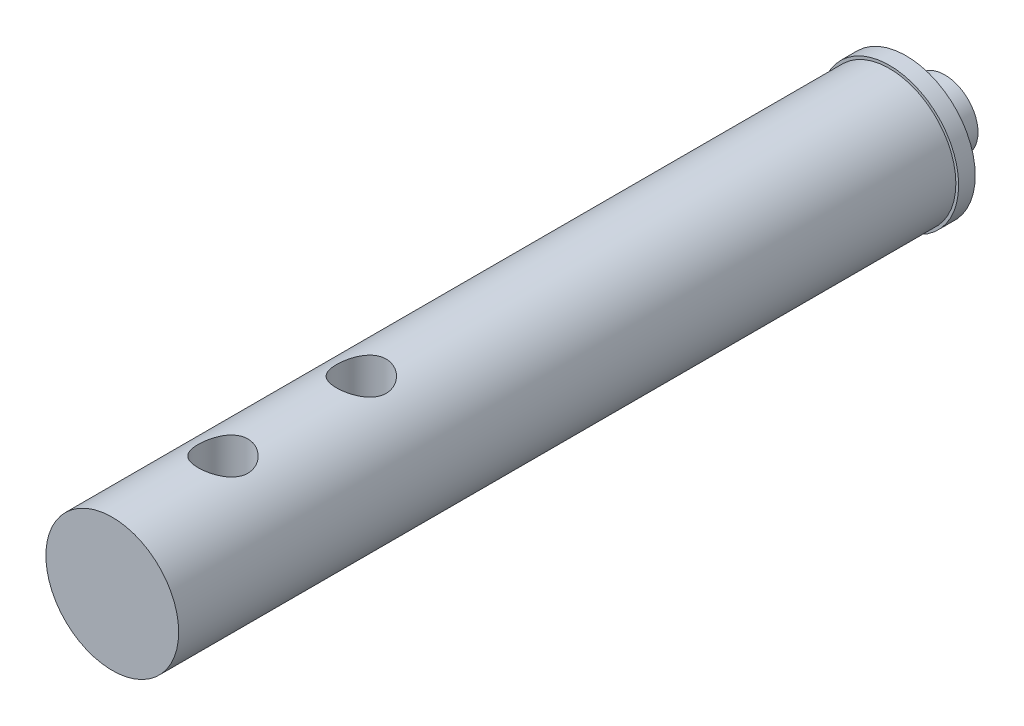
ISO-10303-21;
HEADER;
FILE_DESCRIPTION(('STEP AP214'),'2;1');
FILE_NAME('part.step','',(''),(''),'','','');
FILE_SCHEMA(('AUTOMOTIVE_DESIGN { 1 0 10303 214 1 1 1 1 }'));
ENDSEC;
DATA;
#1=APPLICATION_CONTEXT('core data for automotive mechanical design processes');
#2=APPLICATION_PROTOCOL_DEFINITION('international standard','automotive_design',2000,#1);
#3=PRODUCT_CONTEXT('',#1,'mechanical');
#4=PRODUCT('Part','Part','',(#3));
#5=PRODUCT_RELATED_PRODUCT_CATEGORY('part','',(#4));
#6=PRODUCT_DEFINITION_FORMATION('','',#4);
#7=PRODUCT_DEFINITION_CONTEXT('part definition',#1,'design');
#8=PRODUCT_DEFINITION('design','',#6,#7);
#9=PRODUCT_DEFINITION_SHAPE('','',#8);
#10=(LENGTH_UNIT() NAMED_UNIT(*) SI_UNIT(.MILLI.,.METRE.));
#11=(NAMED_UNIT(*) PLANE_ANGLE_UNIT() SI_UNIT($,.RADIAN.));
#12=(NAMED_UNIT(*) SI_UNIT($,.STERADIAN.) SOLID_ANGLE_UNIT());
#13=UNCERTAINTY_MEASURE_WITH_UNIT(LENGTH_MEASURE(1.E-05),#10,'distance_accuracy_value','');
#14=(GEOMETRIC_REPRESENTATION_CONTEXT(3) GLOBAL_UNCERTAINTY_ASSIGNED_CONTEXT((#13)) GLOBAL_UNIT_ASSIGNED_CONTEXT((#10,
#11,#12)) REPRESENTATION_CONTEXT('',''));
#15=CARTESIAN_POINT('',(0.,0.,0.));
#16=DIRECTION('',(0.,0.,1.));
#17=DIRECTION('',(1.,0.,0.));
#18=AXIS2_PLACEMENT_3D('',#15,#16,#17);
#19=CARTESIAN_POINT('',(0.,0.,7.00000000000012));
#20=DIRECTION('',(0.,0.,-1.));
#21=DIRECTION('',(-1.,0.,0.));
#22=AXIS2_PLACEMENT_3D('',#19,#20,#21);
#23=CYLINDRICAL_SURFACE('',#22,6.);
#24=CARTESIAN_POINT('',(0.,0.,7.00000000000012));
#25=DIRECTION('',(0.,0.,1.));
#26=DIRECTION('',(1.,0.,0.));
#27=AXIS2_PLACEMENT_3D('',#24,#25,#26);
#28=CIRCLE('',#27,6.);
#29=CARTESIAN_POINT('',(6.,0.,7.00000000000012));
#30=VERTEX_POINT('',#29);
#31=EDGE_CURVE('E52',#30,#30,#28,.T.);
#32=ORIENTED_EDGE('',*,*,#31,.F.);
#33=EDGE_LOOP('',(#32));
#34=FACE_BOUND('',#33,.T.);
#35=CARTESIAN_POINT('',(0.,0.,0.));
#36=DIRECTION('',(0.,0.,1.));
#37=DIRECTION('',(1.,0.,0.));
#38=AXIS2_PLACEMENT_3D('',#35,#36,#37);
#39=CIRCLE('',#38,6.);
#40=CARTESIAN_POINT('',(6.,0.,0.));
#41=VERTEX_POINT('',#40);
#42=EDGE_CURVE('E59',#41,#41,#39,.T.);
#43=ORIENTED_EDGE('',*,*,#42,.T.);
#44=EDGE_LOOP('',(#43));
#45=FACE_BOUND('',#44,.T.);
#46=ADVANCED_FACE('F39',(#34,#45),#23,.T.);
#47=CARTESIAN_POINT('',(0.,0.,0.));
#48=DIRECTION('',(0.,0.,1.));
#49=DIRECTION('',(1.,0.,0.));
#50=AXIS2_PLACEMENT_3D('',#47,#48,#49);
#51=PLANE('',#50);
#52=ORIENTED_EDGE('',*,*,#42,.F.);
#53=EDGE_LOOP('',(#52));
#54=FACE_BOUND('',#53,.T.);
#55=ADVANCED_FACE('F108',(#54),#51,.F.);
#56=CARTESIAN_POINT('',(0.,0.,10.));
#57=DIRECTION('',(0.,0.,-1.));
#58=DIRECTION('',(-1.,0.,0.));
#59=AXIS2_PLACEMENT_3D('',#56,#57,#58);
#60=CYLINDRICAL_SURFACE('',#59,12.5);
#61=CARTESIAN_POINT('',(0.,0.,10.));
#62=DIRECTION('',(0.,0.,1.));
#63=DIRECTION('',(1.,0.,0.));
#64=AXIS2_PLACEMENT_3D('',#61,#62,#63);
#65=CIRCLE('',#64,12.5);
#66=CARTESIAN_POINT('',(12.5,0.,10.));
#67=VERTEX_POINT('',#66);
#68=EDGE_CURVE('E64',#67,#67,#65,.T.);
#69=ORIENTED_EDGE('',*,*,#68,.F.);
#70=EDGE_LOOP('',(#69));
#71=FACE_BOUND('',#70,.T.);
#72=CARTESIAN_POINT('',(0.,0.,7.00000000000012));
#73=DIRECTION('',(0.,0.,1.));
#74=DIRECTION('',(1.,0.,0.));
#75=AXIS2_PLACEMENT_3D('',#72,#73,#74);
#76=CIRCLE('',#75,12.5);
#77=CARTESIAN_POINT('',(12.5,0.,7.00000000000012));
#78=VERTEX_POINT('',#77);
#79=EDGE_CURVE('E68',#78,#78,#76,.T.);
#80=ORIENTED_EDGE('',*,*,#79,.T.);
#81=EDGE_LOOP('',(#80));
#82=FACE_BOUND('',#81,.T.);
#83=ADVANCED_FACE('F113',(#71,#82),#60,.T.);
#84=CARTESIAN_POINT('',(0.,0.,10.));
#85=DIRECTION('',(0.,0.,1.));
#86=DIRECTION('',(1.,0.,0.));
#87=AXIS2_PLACEMENT_3D('',#84,#85,#86);
#88=PLANE('',#87);
#89=CARTESIAN_POINT('',(0.,0.,10.));
#90=DIRECTION('',(0.,0.,1.));
#91=DIRECTION('',(1.,0.,0.));
#92=AXIS2_PLACEMENT_3D('',#89,#90,#91);
#93=CIRCLE('',#92,12.);
#94=CARTESIAN_POINT('',(12.,0.,10.));
#95=VERTEX_POINT('',#94);
#96=EDGE_CURVE('E10',#95,#95,#93,.T.);
#97=ORIENTED_EDGE('',*,*,#96,.F.);
#98=EDGE_LOOP('',(#97));
#99=FACE_BOUND('',#98,.T.);
#100=ORIENTED_EDGE('',*,*,#68,.T.);
#101=EDGE_LOOP('',(#100));
#102=FACE_BOUND('',#101,.T.);
#103=ADVANCED_FACE('F121',(#99,#102),#88,.T.);
#104=CARTESIAN_POINT('',(0.,0.,7.00000000000012));
#105=DIRECTION('',(0.,0.,1.));
#106=DIRECTION('',(1.,0.,0.));
#107=AXIS2_PLACEMENT_3D('',#104,#105,#106);
#108=PLANE('',#107);
#109=ORIENTED_EDGE('',*,*,#31,.T.);
#110=EDGE_LOOP('',(#109));
#111=FACE_BOUND('',#110,.T.);
#112=ORIENTED_EDGE('',*,*,#79,.F.);
#113=EDGE_LOOP('',(#112));
#114=FACE_BOUND('',#113,.T.);
#115=ADVANCED_FACE('F104',(#111,#114),#108,.F.);
#116=CARTESIAN_POINT('',(0.,0.,150.45));
#117=DIRECTION('',(0.,0.,-1.));
#118=DIRECTION('',(-1.,0.,0.));
#119=AXIS2_PLACEMENT_3D('',#116,#117,#118);
#120=CYLINDRICAL_SURFACE('',#119,12.);
#121=CARTESIAN_POINT('',(0.,-12.,109.95));
#122=CARTESIAN_POINT('',(0.121821920216143,-12.0000004149463,109.950000562589));
#123=CARTESIAN_POINT('',(0.243636002691339,-11.9981409348073,109.945049364538));
#124=CARTESIAN_POINT('',(0.486392423781219,-11.9907535477711,109.925293911887));
#125=CARTESIAN_POINT('',(0.607334471202255,-11.9852244680872,109.910486507286));
#126=CARTESIAN_POINT('',(0.847347381687188,-11.970649565472,109.871174413436));
#127=CARTESIAN_POINT('',(0.966419205128135,-11.9616056132673,109.846674882519));
#128=CARTESIAN_POINT('',(1.2019581040135,-11.9402382455256,109.78820576059));
#129=CARTESIAN_POINT('',(1.31842414848255,-11.9279135559973,109.754232490447));
#130=CARTESIAN_POINT('',(1.54765442429004,-11.9003384511568,109.677214849951));
#131=CARTESIAN_POINT('',(1.66042673449101,-11.8850950009216,109.634192050998));
#132=CARTESIAN_POINT('',(1.88185705605879,-11.8520536393113,109.539393964957));
#133=CARTESIAN_POINT('',(1.99051352350809,-11.8342547811235,109.487615432482));
#134=CARTESIAN_POINT('',(2.30927279411986,-11.7776768093622,109.319731594457));
#135=CARTESIAN_POINT('',(2.51234231941557,-11.7356939966761,109.191018203868));
#136=CARTESIAN_POINT('',(2.90206977477988,-11.6455850212357,108.898156633399));
#137=CARTESIAN_POINT('',(3.08780172063126,-11.5972851945296,108.732840477992));
#138=CARTESIAN_POINT('',(3.42974311725176,-11.500801507554,108.373737421702));
#139=CARTESIAN_POINT('',(3.58594353155377,-11.4526176872201,108.179941838426));
#140=CARTESIAN_POINT('',(3.79764477617944,-11.3834841407686,107.867559070828));
#141=CARTESIAN_POINT('',(3.86547493196534,-11.3605705131175,107.757562616254));
#142=CARTESIAN_POINT('',(3.99157408188854,-11.3168804194774,107.531831512047));
#143=CARTESIAN_POINT('',(4.04984690983614,-11.2961030977882,107.416099187672));
#144=CARTESIAN_POINT('',(4.15634309619242,-11.2573544123991,107.179634242611));
#145=CARTESIAN_POINT('',(4.20456527896396,-11.2393833770156,107.058901038945));
#146=CARTESIAN_POINT('',(4.29047551547083,-11.2068698048304,106.813350953977));
#147=CARTESIAN_POINT('',(4.32816865016453,-11.1923256148824,106.688536074949));
#148=CARTESIAN_POINT('',(4.39133833063889,-11.167687799886,106.440864282486));
#149=CARTESIAN_POINT('',(4.41724869222401,-11.1574374723367,106.318133574559));
#150=CARTESIAN_POINT('',(4.45874705417236,-11.1409189584307,106.070724885637));
#151=CARTESIAN_POINT('',(4.47433956871922,-11.1346490306496,105.946047780687));
#152=CARTESIAN_POINT('',(4.49504192825722,-11.1263077224061,105.695703904304));
#153=CARTESIAN_POINT('',(4.50015334189904,-11.124235713664,105.570037283793));
#154=CARTESIAN_POINT('',(4.4998396408155,-11.124362586323,105.318723898627));
#155=CARTESIAN_POINT('',(4.4944149347736,-11.1265613020677,105.19307713339));
#156=CARTESIAN_POINT('',(4.47373138181251,-11.1348931002806,104.950345583509));
#157=CARTESIAN_POINT('',(4.4590833434736,-11.1407817124043,104.833200175152));
#158=CARTESIAN_POINT('',(4.42068867776496,-11.1560711786316,104.600631735769));
#159=CARTESIAN_POINT('',(4.39693902815623,-11.1654731993557,104.485209290103));
#160=CARTESIAN_POINT('',(4.31234407385654,-11.1985472030748,104.142770983111));
#161=CARTESIAN_POINT('',(4.23813423625877,-11.2270952052095,103.919371280221));
#162=CARTESIAN_POINT('',(4.05490721343479,-11.294571324263,103.484132319446));
#163=CARTESIAN_POINT('',(3.94525805379047,-11.3336856090866,103.27259174478));
#164=CARTESIAN_POINT('',(3.69468362169031,-11.417826234714,102.870172587469));
#165=CARTESIAN_POINT('',(3.55374755073014,-11.4628546145386,102.679301172593));
#166=CARTESIAN_POINT('',(3.23345300799873,-11.5574411862383,102.310186122089));
#167=CARTESIAN_POINT('',(3.05214885027356,-11.607100429164,102.13365330368));
#168=CARTESIAN_POINT('',(2.66193788370926,-11.7027518394278,101.812986875577));
#169=CARTESIAN_POINT('',(2.45302684040982,-11.7487434424691,101.668858245353));
#170=CARTESIAN_POINT('',(2.00917028059689,-11.8327918458053,101.415208596408));
#171=CARTESIAN_POINT('',(1.77387213379261,-11.8707149483013,101.306257198474));
#172=CARTESIAN_POINT('',(1.28651055931184,-11.9333615492963,101.130052245027));
#173=CARTESIAN_POINT('',(1.03445463312944,-11.9580909097264,101.0627801694));
#174=CARTESIAN_POINT('',(0.535125728885341,-11.9905332973328,100.975131619306));
#175=CARTESIAN_POINT('',(0.288310863440809,-11.9990810722223,100.952452162351));
#176=CARTESIAN_POINT('',(-0.205717430518202,-12.0007768095524,100.947926826798));
#177=CARTESIAN_POINT('',(-0.452930758520927,-11.9939281862917,100.966071894972));
#178=CARTESIAN_POINT('',(-0.930786126866777,-11.9661512982893,101.040930073153));
#179=CARTESIAN_POINT('',(-1.16169991458786,-11.9457741475744,101.096134437354));
#180=CARTESIAN_POINT('',(-1.61082533431483,-11.8935442940439,101.241558411525));
#181=CARTESIAN_POINT('',(-1.82903531000967,-11.8616900987367,101.331782575638));
#182=CARTESIAN_POINT('',(-2.25374302875422,-11.7884888040033,101.547558494317));
#183=CARTESIAN_POINT('',(-2.4597082422869,-11.7468902777666,101.674070377444));
#184=CARTESIAN_POINT('',(-2.84817914393921,-11.6587998753534,101.95775712078));
#185=CARTESIAN_POINT('',(-3.03067612982124,-11.6123061955645,102.114943301224));
#186=CARTESIAN_POINT('',(-3.37808840855274,-11.516200958323,102.466201253386));
#187=CARTESIAN_POINT('',(-3.54136933947526,-11.4665650100462,102.661883953797));
#188=CARTESIAN_POINT('',(-3.83314678656077,-11.372360357102,103.078996752467));
#189=CARTESIAN_POINT('',(-3.96164017919754,-11.3277921076647,103.300429160208));
#190=CARTESIAN_POINT('',(-4.12541953452075,-11.2687303690453,103.647922796397));
#191=CARTESIAN_POINT('',(-4.17527938653558,-11.2503030894951,103.766647329586));
#192=CARTESIAN_POINT('',(-4.26475585416722,-11.2166905930926,104.008323845116));
#193=CARTESIAN_POINT('',(-4.30437682733462,-11.2015039975232,104.131274003754));
#194=CARTESIAN_POINT('',(-4.37296242168505,-11.1749073223601,104.380466472104));
#195=CARTESIAN_POINT('',(-4.40193024471254,-11.163496108165,104.506707780413));
#196=CARTESIAN_POINT('',(-4.44890662829911,-11.1448585297206,104.76151813959));
#197=CARTESIAN_POINT('',(-4.46691595320738,-11.1376318736025,104.890087027466));
#198=CARTESIAN_POINT('',(-4.4909611175474,-11.1279568107625,105.140138338187));
#199=CARTESIAN_POINT('',(-4.4976937576826,-11.1252304971503,105.261543515748));
#200=CARTESIAN_POINT('',(-4.50131029580419,-11.1237678185175,105.504568299403));
#201=CARTESIAN_POINT('',(-4.49819087218451,-11.1250327991546,105.626187963996));
#202=CARTESIAN_POINT('',(-4.4821328006696,-11.131512007523,105.868611778483));
#203=CARTESIAN_POINT('',(-4.46919877710473,-11.1367243753675,105.989416285416));
#204=CARTESIAN_POINT('',(-4.43364891145921,-11.150924738849,106.229410101132));
#205=CARTESIAN_POINT('',(-4.41102942370238,-11.1599141561698,106.348598784262));
#206=CARTESIAN_POINT('',(-4.35718066722756,-11.1810458214159,106.580811506595));
#207=CARTESIAN_POINT('',(-4.32623979458423,-11.1930817833517,106.693912139277));
#208=CARTESIAN_POINT('',(-4.25575591081447,-11.220069483486,106.917056271898));
#209=CARTESIAN_POINT('',(-4.21620988547504,-11.23502224319,107.027098685333));
#210=CARTESIAN_POINT('',(-4.08512625929661,-11.2836374066331,107.351595505612));
#211=CARTESIAN_POINT('',(-3.98110253179988,-11.3210734609741,107.560592817196));
#212=CARTESIAN_POINT('',(-3.73655960136618,-11.4041928736043,107.969509886323));
#213=CARTESIAN_POINT('',(-3.59441315608532,-11.4502056852775,108.168379513829));
#214=CARTESIAN_POINT('',(-3.28000639093496,-11.5441926723435,108.540437563583));
#215=CARTESIAN_POINT('',(-3.10773650011233,-11.5921674673836,108.713617791262));
#216=CARTESIAN_POINT('',(-2.82485495768739,-11.6632064644304,108.955245875948));
#217=CARTESIAN_POINT('',(-2.7235567704114,-11.6873329442322,109.034523984934));
#218=CARTESIAN_POINT('',(-2.5143325103599,-11.7341212355869,109.184254321495));
#219=CARTESIAN_POINT('',(-2.40640888366378,-11.7567835814237,109.254709777492));
#220=CARTESIAN_POINT('',(-2.1845450968735,-11.8000231112314,109.386294134108));
#221=CARTESIAN_POINT('',(-2.07060177268693,-11.8205991816831,109.447418062869));
#222=CARTESIAN_POINT('',(-1.83755175113719,-11.8590616275344,109.559759993606));
#223=CARTESIAN_POINT('',(-1.71844727331546,-11.8769491446375,109.61098220304));
#224=CARTESIAN_POINT('',(-1.47053797162901,-11.9102407175975,109.705097964792));
#225=CARTESIAN_POINT('',(-1.34153686175291,-11.9255011706843,109.747526838323));
#226=CARTESIAN_POINT('',(-1.07989915577465,-11.9520331999051,109.820612963128));
#227=CARTESIAN_POINT('',(-0.947264179674964,-11.9633065233273,109.851275371348));
#228=CARTESIAN_POINT('',(-0.679492491904588,-11.9814979813589,109.900485060083));
#229=CARTESIAN_POINT('',(-0.544356226207081,-11.9884168847946,109.919034479318));
#230=CARTESIAN_POINT('',(-0.272809934790558,-11.9976674031164,109.943790938277));
#231=CARTESIAN_POINT('',(-0.136400054481805,-11.9999995353981,109.949999370088));
#232=CARTESIAN_POINT('',(0.,-12.,109.95));
#233=B_SPLINE_CURVE_WITH_KNOTS('',3,(#121,#122,#123,#124,#125,#126,#127,#128,#129,#130,#131,
#132,#133,#134,#135,#136,#137,#138,#139,#140,#141,#142,#143,#144,#145,#146,#147,#148,#149,#150,
#151,#152,#153,#154,#155,#156,#157,#158,#159,#160,#161,#162,#163,#164,#165,#166,#167,#168,#169,
#170,#171,#172,#173,#174,#175,#176,#177,#178,#179,#180,#181,#182,#183,#184,#185,#186,#187,#188,
#189,#190,#191,#192,#193,#194,#195,#196,#197,#198,#199,#200,#201,#202,#203,#204,#205,#206,#207,
#208,#209,#210,#211,#212,#213,#214,#215,#216,#217,#218,#219,#220,#221,#222,#223,#224,#225,#226,
#227,#228,#229,#230,#231,#232),.UNSPECIFIED.,.T.,.F.,(4,2,2,2,2,2,2,2,2,2,2,2,2,2,2,2,2,2,2,2,2,
2,2,2,2,2,2,2,2,2,2,2,2,2,2,2,2,2,2,2,2,2,2,2,2,2,2,2,2,2,2,2,2,2,2,4),(0.,0.365338024506956,
0.730792865566526,1.09605346575198,1.46145611308565,1.82599742407274,2.19067415273863,
2.9194701839264,3.67616860257937,4.43309819286654,4.82642681378561,5.21959726757255,
5.61281368524463,6.00584002102325,6.38291145568138,6.75981780772978,7.13666774608814,
7.51350306718058,7.86768402280131,8.22198268815961,8.92994647641834,9.6513045862112,
10.3729120569284,11.143016934675,11.9132400717526,12.6953735931829,13.477159325566,
14.2173829236784,14.9574423863163,15.6690654723159,16.3807811322343,17.1134089903887,
17.8463077351967,18.6217279182704,19.3972177022049,19.7870381951626,20.1766925107005,
20.5662296182681,20.9557395527225,21.3201489316714,21.6846811837186,22.0490417862153,
22.413539657309,22.7667469946613,23.1200782532195,23.8262105801187,24.5693581369517,
25.3127422403355,25.7049754844993,26.0970647789657,26.4893622558027,26.8814926686161,
27.2908478409866,27.7000233978563,28.1091266894863,28.5181838309154),.UNSPECIFIED.);
#234=CARTESIAN_POINT('',(0.,-12.,109.95));
#235=VERTEX_POINT('',#234);
#236=EDGE_CURVE('E42',#235,#235,#233,.T.);
#237=ORIENTED_EDGE('',*,*,#236,.T.);
#238=EDGE_LOOP('',(#237));
#239=FACE_BOUND('',#238,.T.);
#240=CARTESIAN_POINT('',(0.,12.,109.95));
#241=CARTESIAN_POINT('',(-0.12182192021615,12.0000004149463,109.950000562589));
#242=CARTESIAN_POINT('',(-0.243636002691346,11.9981409348073,109.945049364538));
#243=CARTESIAN_POINT('',(-0.486392423781228,11.9907535477711,109.925293911887));
#244=CARTESIAN_POINT('',(-0.607334471202264,11.9852244680872,109.910486507286));
#245=CARTESIAN_POINT('',(-0.847347381687197,11.970649565472,109.871174413436));
#246=CARTESIAN_POINT('',(-0.966419205128143,11.9616056132673,109.846674882519));
#247=CARTESIAN_POINT('',(-1.20195810401351,11.9402382455256,109.78820576059));
#248=CARTESIAN_POINT('',(-1.31842414848256,11.9279135559973,109.754232490447));
#249=CARTESIAN_POINT('',(-1.54765442429004,11.9003384511568,109.677214849951));
#250=CARTESIAN_POINT('',(-1.66042673449101,11.8850950009216,109.634192050998));
#251=CARTESIAN_POINT('',(-1.8818570560588,11.8520536393113,109.539393964957));
#252=CARTESIAN_POINT('',(-1.9905135235081,11.8342547811235,109.487615432482));
#253=CARTESIAN_POINT('',(-2.30927279411987,11.7776768093622,109.319731594457));
#254=CARTESIAN_POINT('',(-2.51234231941558,11.7356939966761,109.191018203868));
#255=CARTESIAN_POINT('',(-2.90206977477989,11.6455850212357,108.898156633399));
#256=CARTESIAN_POINT('',(-3.08780172063126,11.5972851945296,108.732840477992));
#257=CARTESIAN_POINT('',(-3.42974311725177,11.500801507554,108.373737421702));
#258=CARTESIAN_POINT('',(-3.58594353155378,11.4526176872201,108.179941838426));
#259=CARTESIAN_POINT('',(-3.79764477617945,11.3834841407686,107.867559070828));
#260=CARTESIAN_POINT('',(-3.86547493196535,11.3605705131175,107.757562616254));
#261=CARTESIAN_POINT('',(-3.99157408188855,11.3168804194774,107.531831512047));
#262=CARTESIAN_POINT('',(-4.04984690983615,11.2961030977882,107.416099187672));
#263=CARTESIAN_POINT('',(-4.15634309619243,11.2573544123991,107.179634242611));
#264=CARTESIAN_POINT('',(-4.20456527896397,11.2393833770156,107.058901038945));
#265=CARTESIAN_POINT('',(-4.29047551547084,11.2068698048304,106.813350953977));
#266=CARTESIAN_POINT('',(-4.32816865016454,11.1923256148824,106.688536074949));
#267=CARTESIAN_POINT('',(-4.3913383306389,11.167687799886,106.440864282486));
#268=CARTESIAN_POINT('',(-4.41724869222402,11.1574374723367,106.318133574559));
#269=CARTESIAN_POINT('',(-4.45874705417237,11.1409189584307,106.070724885637));
#270=CARTESIAN_POINT('',(-4.47433956871923,11.1346490306496,105.946047780687));
#271=CARTESIAN_POINT('',(-4.49504192825722,11.1263077224061,105.695703904304));
#272=CARTESIAN_POINT('',(-4.50015334189905,11.124235713664,105.570037283793));
#273=CARTESIAN_POINT('',(-4.49983964081551,11.124362586323,105.318723898627));
#274=CARTESIAN_POINT('',(-4.4944149347736,11.1265613020677,105.19307713339));
#275=CARTESIAN_POINT('',(-4.47373138181252,11.1348931002806,104.950345583509));
#276=CARTESIAN_POINT('',(-4.45908334347361,11.1407817124043,104.833200175152));
#277=CARTESIAN_POINT('',(-4.42068867776496,11.1560711786316,104.600631735769));
#278=CARTESIAN_POINT('',(-4.39693902815623,11.1654731993557,104.485209290103));
#279=CARTESIAN_POINT('',(-4.31234407385654,11.1985472030748,104.142770983111));
#280=CARTESIAN_POINT('',(-4.23813423625877,11.2270952052095,103.919371280221));
#281=CARTESIAN_POINT('',(-4.05490721343479,11.294571324263,103.484132319446));
#282=CARTESIAN_POINT('',(-3.94525805379047,11.3336856090865,103.27259174478));
#283=CARTESIAN_POINT('',(-3.69468362169032,11.417826234714,102.870172587469));
#284=CARTESIAN_POINT('',(-3.55374755073015,11.4628546145386,102.679301172593));
#285=CARTESIAN_POINT('',(-3.23345300799874,11.5574411862383,102.310186122089));
#286=CARTESIAN_POINT('',(-3.05214885027357,11.607100429164,102.13365330368));
#287=CARTESIAN_POINT('',(-2.66193788370927,11.7027518394278,101.812986875577));
#288=CARTESIAN_POINT('',(-2.45302684040983,11.7487434424691,101.668858245353));
#289=CARTESIAN_POINT('',(-2.00917028059689,11.8327918458053,101.415208596408));
#290=CARTESIAN_POINT('',(-1.77387213379262,11.8707149483013,101.306257198474));
#291=CARTESIAN_POINT('',(-1.28651055931185,11.9333615492963,101.130052245027));
#292=CARTESIAN_POINT('',(-1.03445463312945,11.9580909097264,101.0627801694));
#293=CARTESIAN_POINT('',(-0.535125728885348,11.9905332973328,100.975131619306));
#294=CARTESIAN_POINT('',(-0.288310863440815,11.9990810722223,100.952452162351));
#295=CARTESIAN_POINT('',(0.205717430518195,12.0007768095524,100.947926826798));
#296=CARTESIAN_POINT('',(0.45293075852092,11.9939281862917,100.966071894972));
#297=CARTESIAN_POINT('',(0.930786126866771,11.9661512982893,101.040930073153));
#298=CARTESIAN_POINT('',(1.16169991458786,11.9457741475744,101.096134437354));
#299=CARTESIAN_POINT('',(1.61082533431483,11.8935442940439,101.241558411525));
#300=CARTESIAN_POINT('',(1.82903531000966,11.8616900987367,101.331782575638));
#301=CARTESIAN_POINT('',(2.25374302875422,11.7884888040033,101.547558494317));
#302=CARTESIAN_POINT('',(2.4597082422869,11.7468902777666,101.674070377444));
#303=CARTESIAN_POINT('',(2.8481791439392,11.6587998753534,101.95775712078));
#304=CARTESIAN_POINT('',(3.03067612982124,11.6123061955645,102.114943301224));
#305=CARTESIAN_POINT('',(3.37808840855274,11.516200958323,102.466201253386));
#306=CARTESIAN_POINT('',(3.54136933947526,11.4665650100462,102.661883953797));
#307=CARTESIAN_POINT('',(3.83314678656077,11.372360357102,103.078996752467));
#308=CARTESIAN_POINT('',(3.96164017919753,11.3277921076647,103.300429160208));
#309=CARTESIAN_POINT('',(4.12541953452074,11.2687303690453,103.647922796397));
#310=CARTESIAN_POINT('',(4.17527938653558,11.2503030894951,103.766647329586));
#311=CARTESIAN_POINT('',(4.26475585416722,11.2166905930926,104.008323845116));
#312=CARTESIAN_POINT('',(4.30437682733461,11.2015039975232,104.131274003754));
#313=CARTESIAN_POINT('',(4.37296242168505,11.1749073223601,104.380466472104));
#314=CARTESIAN_POINT('',(4.40193024471253,11.163496108165,104.506707780413));
#315=CARTESIAN_POINT('',(4.4489066282991,11.1448585297206,104.76151813959));
#316=CARTESIAN_POINT('',(4.46691595320738,11.1376318736025,104.890087027466));
#317=CARTESIAN_POINT('',(4.49096111754739,11.1279568107625,105.140138338187));
#318=CARTESIAN_POINT('',(4.49769375768259,11.1252304971503,105.261543515748));
#319=CARTESIAN_POINT('',(4.50131029580418,11.1237678185175,105.504568299403));
#320=CARTESIAN_POINT('',(4.4981908721845,11.1250327991546,105.626187963996));
#321=CARTESIAN_POINT('',(4.48213280066959,11.131512007523,105.868611778483));
#322=CARTESIAN_POINT('',(4.46919877710473,11.1367243753675,105.989416285416));
#323=CARTESIAN_POINT('',(4.43364891145921,11.150924738849,106.229410101132));
#324=CARTESIAN_POINT('',(4.41102942370237,11.1599141561698,106.348598784262));
#325=CARTESIAN_POINT('',(4.35718066722755,11.1810458214159,106.580811506595));
#326=CARTESIAN_POINT('',(4.32623979458422,11.1930817833517,106.693912139277));
#327=CARTESIAN_POINT('',(4.25575591081447,11.220069483486,106.917056271898));
#328=CARTESIAN_POINT('',(4.21620988547503,11.23502224319,107.027098685333));
#329=CARTESIAN_POINT('',(4.08512625929661,11.2836374066331,107.351595505612));
#330=CARTESIAN_POINT('',(3.98110253179988,11.3210734609741,107.560592817196));
#331=CARTESIAN_POINT('',(3.73655960136617,11.4041928736043,107.969509886323));
#332=CARTESIAN_POINT('',(3.59441315608531,11.4502056852775,108.168379513829));
#333=CARTESIAN_POINT('',(3.28000639093495,11.5441926723435,108.540437563583));
#334=CARTESIAN_POINT('',(3.10773650011232,11.5921674673836,108.713617791262));
#335=CARTESIAN_POINT('',(2.82485495768738,11.6632064644304,108.955245875948));
#336=CARTESIAN_POINT('',(2.72355677041139,11.6873329442322,109.034523984934));
#337=CARTESIAN_POINT('',(2.5143325103599,11.7341212355869,109.184254321495));
#338=CARTESIAN_POINT('',(2.40640888366377,11.7567835814237,109.254709777492));
#339=CARTESIAN_POINT('',(2.18454509687349,11.8000231112314,109.386294134108));
#340=CARTESIAN_POINT('',(2.07060177268691,11.8205991816831,109.447418062869));
#341=CARTESIAN_POINT('',(1.83755175113717,11.8590616275344,109.559759993606));
#342=CARTESIAN_POINT('',(1.71844727331545,11.8769491446375,109.61098220304));
#343=CARTESIAN_POINT('',(1.470537971629,11.9102407175975,109.705097964792));
#344=CARTESIAN_POINT('',(1.3415368617529,11.9255011706843,109.747526838323));
#345=CARTESIAN_POINT('',(1.07989915577464,11.9520331999052,109.820612963128));
#346=CARTESIAN_POINT('',(0.947264179674955,11.9633065233273,109.851275371348));
#347=CARTESIAN_POINT('',(0.679492491904581,11.9814979813589,109.900485060083));
#348=CARTESIAN_POINT('',(0.544356226207074,11.9884168847946,109.919034479318));
#349=CARTESIAN_POINT('',(0.272809934790552,11.9976674031164,109.943790938277));
#350=CARTESIAN_POINT('',(0.136400054481798,11.9999995353981,109.949999370088));
#351=CARTESIAN_POINT('',(0.,12.,109.95));
#352=B_SPLINE_CURVE_WITH_KNOTS('',3,(#240,#241,#242,#243,#244,#245,#246,#247,#248,#249,#250,
#251,#252,#253,#254,#255,#256,#257,#258,#259,#260,#261,#262,#263,#264,#265,#266,#267,#268,#269,
#270,#271,#272,#273,#274,#275,#276,#277,#278,#279,#280,#281,#282,#283,#284,#285,#286,#287,#288,
#289,#290,#291,#292,#293,#294,#295,#296,#297,#298,#299,#300,#301,#302,#303,#304,#305,#306,#307,
#308,#309,#310,#311,#312,#313,#314,#315,#316,#317,#318,#319,#320,#321,#322,#323,#324,#325,#326,
#327,#328,#329,#330,#331,#332,#333,#334,#335,#336,#337,#338,#339,#340,#341,#342,#343,#344,#345,
#346,#347,#348,#349,#350,#351),.UNSPECIFIED.,.T.,.F.,(4,2,2,2,2,2,2,2,2,2,2,2,2,2,2,2,2,2,2,2,2,
2,2,2,2,2,2,2,2,2,2,2,2,2,2,2,2,2,2,2,2,2,2,2,2,2,2,2,2,2,2,2,2,2,2,4),(0.,0.365338024506957,
0.730792865566528,1.09605346575198,1.46145611308565,1.82599742407274,2.19067415273863,
2.9194701839264,3.67616860257937,4.43309819286654,4.82642681378561,5.21959726757256,
5.61281368524463,6.00584002102325,6.38291145568138,6.75981780772979,7.13666774608814,
7.51350306718058,7.86768402280129,8.22198268815962,8.92994647641835,9.6513045862112,
10.3729120569284,11.143016934675,11.9132400717526,12.6953735931829,13.477159325566,
14.2173829236784,14.9574423863163,15.6690654723159,16.3807811322343,17.1134089903887,
17.8463077351967,18.6217279182704,19.3972177022049,19.7870381951626,20.1766925107005,
20.5662296182681,20.9557395527225,21.3201489316714,21.6846811837186,22.0490417862153,
22.413539657309,22.7667469946613,23.1200782532195,23.8262105801187,24.5693581369517,
25.3127422403355,25.7049754844993,26.0970647789657,26.4893622558027,26.8814926686161,
27.2908478409866,27.7000233978563,28.1091266894863,28.5181838309154),.UNSPECIFIED.);
#353=CARTESIAN_POINT('',(0.,12.,109.95));
#354=VERTEX_POINT('',#353);
#355=EDGE_CURVE('E169',#354,#354,#352,.T.);
#356=ORIENTED_EDGE('',*,*,#355,.T.);
#357=EDGE_LOOP('',(#356));
#358=FACE_BOUND('',#357,.T.);
#359=CARTESIAN_POINT('',(0.,-12.,134.95));
#360=CARTESIAN_POINT('',(0.121821920216142,-12.0000004149463,134.950000562589));
#361=CARTESIAN_POINT('',(0.243636002691338,-11.9981409348073,134.945049364538));
#362=CARTESIAN_POINT('',(0.486392423781218,-11.9907535477711,134.925293911887));
#363=CARTESIAN_POINT('',(0.607334471202255,-11.9852244680872,134.910486507286));
#364=CARTESIAN_POINT('',(0.847347381687192,-11.970649565472,134.871174413435));
#365=CARTESIAN_POINT('',(0.966419205128141,-11.9616056132673,134.846674882519));
#366=CARTESIAN_POINT('',(1.20195810401351,-11.9402382455256,134.78820576059));
#367=CARTESIAN_POINT('',(1.31842414848256,-11.9279135559973,134.754232490447));
#368=CARTESIAN_POINT('',(1.54765442429003,-11.9003384511568,134.677214849951));
#369=CARTESIAN_POINT('',(1.660426734491,-11.8850950009216,134.634192050998));
#370=CARTESIAN_POINT('',(1.88185705605876,-11.8520536393113,134.539393964956));
#371=CARTESIAN_POINT('',(1.99051352350805,-11.8342547811235,134.487615432482));
#372=CARTESIAN_POINT('',(2.30927279411982,-11.7776768093622,134.319731594457));
#373=CARTESIAN_POINT('',(2.51234231941559,-11.7356939966761,134.191018203868));
#374=CARTESIAN_POINT('',(2.90206977477991,-11.6455850212357,133.8981566334));
#375=CARTESIAN_POINT('',(3.08780172063122,-11.5972851945296,133.732840477992));
#376=CARTESIAN_POINT('',(3.42974311725171,-11.500801507554,133.373737421702));
#377=CARTESIAN_POINT('',(3.58594353155376,-11.4526176872201,133.179941838426));
#378=CARTESIAN_POINT('',(3.79764477617944,-11.3834841407686,132.867559070828));
#379=CARTESIAN_POINT('',(3.86547493196535,-11.3605705131175,132.757562616254));
#380=CARTESIAN_POINT('',(3.99157408188854,-11.3168804194774,132.531831512047));
#381=CARTESIAN_POINT('',(4.04984690983615,-11.2961030977882,132.416099187672));
#382=CARTESIAN_POINT('',(4.15634309619243,-11.2573544123991,132.179634242611));
#383=CARTESIAN_POINT('',(4.20456527896396,-11.2393833770156,132.058901038945));
#384=CARTESIAN_POINT('',(4.29047551547084,-11.2068698048304,131.813350953977));
#385=CARTESIAN_POINT('',(4.32816865016454,-11.1923256148824,131.688536074949));
#386=CARTESIAN_POINT('',(4.3913383306389,-11.167687799886,131.440864282486));
#387=CARTESIAN_POINT('',(4.41724869222401,-11.1574374723367,131.318133574559));
#388=CARTESIAN_POINT('',(4.45874705417236,-11.1409189584307,131.070724885637));
#389=CARTESIAN_POINT('',(4.47433956871922,-11.1346490306496,130.946047780687));
#390=CARTESIAN_POINT('',(4.49504192825722,-11.1263077224061,130.695703904304));
#391=CARTESIAN_POINT('',(4.50015334189904,-11.124235713664,130.570037283793));
#392=CARTESIAN_POINT('',(4.4998396408155,-11.124362586323,130.318723898627));
#393=CARTESIAN_POINT('',(4.4944149347736,-11.1265613020677,130.19307713339));
#394=CARTESIAN_POINT('',(4.47373138181252,-11.1348931002806,129.950345583509));
#395=CARTESIAN_POINT('',(4.45908334347361,-11.1407817124043,129.833200175152));
#396=CARTESIAN_POINT('',(4.42068867776497,-11.1560711786316,129.600631735769));
#397=CARTESIAN_POINT('',(4.39693902815625,-11.1654731993557,129.485209290103));
#398=CARTESIAN_POINT('',(4.31234407385656,-11.1985472030748,129.142770983112));
#399=CARTESIAN_POINT('',(4.23813423625875,-11.2270952052095,128.919371280221));
#400=CARTESIAN_POINT('',(4.05490721343478,-11.294571324263,128.484132319446));
#401=CARTESIAN_POINT('',(3.94525805379051,-11.3336856090865,128.272591744781));
#402=CARTESIAN_POINT('',(3.69468362169037,-11.417826234714,127.870172587469));
#403=CARTESIAN_POINT('',(3.55374755073016,-11.4628546145386,127.679301172593));
#404=CARTESIAN_POINT('',(3.23345300799871,-11.5574411862383,127.310186122089));
#405=CARTESIAN_POINT('',(3.05214885027355,-11.607100429164,127.13365330368));
#406=CARTESIAN_POINT('',(2.66193788370925,-11.7027518394278,126.812986875577));
#407=CARTESIAN_POINT('',(2.4530268404098,-11.7487434424691,126.668858245353));
#408=CARTESIAN_POINT('',(2.00917028059688,-11.8327918458053,126.415208596408));
#409=CARTESIAN_POINT('',(1.77387213379263,-11.8707149483013,126.306257198474));
#410=CARTESIAN_POINT('',(1.28651055931186,-11.9333615492963,126.130052245027));
#411=CARTESIAN_POINT('',(1.03445463312944,-11.9580909097264,126.0627801694));
#412=CARTESIAN_POINT('',(0.535125728885325,-11.9905332973328,125.975131619306));
#413=CARTESIAN_POINT('',(0.288310863440801,-11.9990810722223,125.952452162351));
#414=CARTESIAN_POINT('',(-0.205717430518195,-12.0007768095524,125.947926826798));
#415=CARTESIAN_POINT('',(-0.452930758520915,-11.9939281862917,125.966071894972));
#416=CARTESIAN_POINT('',(-0.930786126866787,-11.9661512982893,126.040930073153));
#417=CARTESIAN_POINT('',(-1.1616999145879,-11.9457741475744,126.096134437354));
#418=CARTESIAN_POINT('',(-1.61082533431487,-11.8935442940439,126.241558411524));
#419=CARTESIAN_POINT('',(-1.82903531000968,-11.8616900987367,126.331782575637));
#420=CARTESIAN_POINT('',(-2.25374302875425,-11.7884888040033,126.547558494317));
#421=CARTESIAN_POINT('',(-2.45970824228696,-11.7468902777666,126.674070377444));
#422=CARTESIAN_POINT('',(-2.84817914393925,-11.6587998753534,126.95775712078));
#423=CARTESIAN_POINT('',(-3.03067612982123,-11.6123061955645,127.114943301224));
#424=CARTESIAN_POINT('',(-3.37808840855276,-11.5162009583229,127.466201253386));
#425=CARTESIAN_POINT('',(-3.54136933947538,-11.4665650100461,127.661883953797));
#426=CARTESIAN_POINT('',(-3.83314678656087,-11.372360357102,128.078996752468));
#427=CARTESIAN_POINT('',(-3.96164017919753,-11.3277921076647,128.300429160209));
#428=CARTESIAN_POINT('',(-4.12541953452076,-11.2687303690453,128.647922796398));
#429=CARTESIAN_POINT('',(-4.17527938653563,-11.2503030894951,128.766647329586));
#430=CARTESIAN_POINT('',(-4.26475585416728,-11.2166905930926,129.008323845116));
#431=CARTESIAN_POINT('',(-4.30437682733466,-11.2015039975232,129.131274003754));
#432=CARTESIAN_POINT('',(-4.37296242168507,-11.1749073223601,129.380466472104));
#433=CARTESIAN_POINT('',(-4.40193024471255,-11.163496108165,129.506707780413));
#434=CARTESIAN_POINT('',(-4.44890662829912,-11.1448585297206,129.76151813959));
#435=CARTESIAN_POINT('',(-4.46691595320739,-11.1376318736025,129.890087027466));
#436=CARTESIAN_POINT('',(-4.4909611175474,-11.1279568107625,130.140138338187));
#437=CARTESIAN_POINT('',(-4.4976937576826,-11.1252304971503,130.261543515748));
#438=CARTESIAN_POINT('',(-4.50131029580419,-11.1237678185175,130.504568299403));
#439=CARTESIAN_POINT('',(-4.49819087218451,-11.1250327991546,130.626187963996));
#440=CARTESIAN_POINT('',(-4.48213280066959,-11.131512007523,130.868611778483));
#441=CARTESIAN_POINT('',(-4.4691987771047,-11.1367243753675,130.989416285416));
#442=CARTESIAN_POINT('',(-4.4336489114592,-11.150924738849,131.229410101132));
#443=CARTESIAN_POINT('',(-4.41102942370239,-11.1599141561698,131.348598784262));
#444=CARTESIAN_POINT('',(-4.35718066722756,-11.1810458214159,131.580811506595));
#445=CARTESIAN_POINT('',(-4.32623979458419,-11.1930817833517,131.693912139277));
#446=CARTESIAN_POINT('',(-4.25575591081441,-11.220069483486,131.917056271898));
#447=CARTESIAN_POINT('',(-4.21620988547498,-11.23502224319,132.027098685333));
#448=CARTESIAN_POINT('',(-4.08512625929658,-11.2836374066331,132.351595505612));
#449=CARTESIAN_POINT('',(-3.98110253179986,-11.3210734609741,132.560592817196));
#450=CARTESIAN_POINT('',(-3.73655960136617,-11.4041928736043,132.969509886323));
#451=CARTESIAN_POINT('',(-3.59441315608532,-11.4502056852775,133.168379513829));
#452=CARTESIAN_POINT('',(-3.28000639093495,-11.5441926723435,133.540437563583));
#453=CARTESIAN_POINT('',(-3.1077365001123,-11.5921674673836,133.713617791262));
#454=CARTESIAN_POINT('',(-2.82485495768736,-11.6632064644304,133.955245875948));
#455=CARTESIAN_POINT('',(-2.72355677041137,-11.6873329442322,134.034523984934));
#456=CARTESIAN_POINT('',(-2.51433251035987,-11.7341212355869,134.184254321495));
#457=CARTESIAN_POINT('',(-2.40640888366373,-11.7567835814237,134.254709777492));
#458=CARTESIAN_POINT('',(-2.18454509687342,-11.8000231112314,134.386294134108));
#459=CARTESIAN_POINT('',(-2.07060177268684,-11.8205991816831,134.447418062869));
#460=CARTESIAN_POINT('',(-1.83755175113714,-11.8590616275344,134.559759993606));
#461=CARTESIAN_POINT('',(-1.71844727331547,-11.8769491446375,134.61098220304));
#462=CARTESIAN_POINT('',(-1.47053797162903,-11.9102407175975,134.705097964792));
#463=CARTESIAN_POINT('',(-1.34153686175289,-11.9255011706843,134.747526838323));
#464=CARTESIAN_POINT('',(-1.0798991557746,-11.9520331999052,134.820612963128));
#465=CARTESIAN_POINT('',(-0.947264179674937,-11.9633065233273,134.851275371347));
#466=CARTESIAN_POINT('',(-0.679492491904578,-11.9814979813589,134.900485060083));
#467=CARTESIAN_POINT('',(-0.544356226207066,-11.9884168847946,134.919034479318));
#468=CARTESIAN_POINT('',(-0.272809934790545,-11.9976674031164,134.943790938277));
#469=CARTESIAN_POINT('',(-0.136400054481799,-11.9999995353981,134.949999370088));
#470=CARTESIAN_POINT('',(0.,-12.,134.95));
#471=B_SPLINE_CURVE_WITH_KNOTS('',3,(#359,#360,#361,#362,#363,#364,#365,#366,#367,#368,#369,
#370,#371,#372,#373,#374,#375,#376,#377,#378,#379,#380,#381,#382,#383,#384,#385,#386,#387,#388,
#389,#390,#391,#392,#393,#394,#395,#396,#397,#398,#399,#400,#401,#402,#403,#404,#405,#406,#407,
#408,#409,#410,#411,#412,#413,#414,#415,#416,#417,#418,#419,#420,#421,#422,#423,#424,#425,#426,
#427,#428,#429,#430,#431,#432,#433,#434,#435,#436,#437,#438,#439,#440,#441,#442,#443,#444,#445,
#446,#447,#448,#449,#450,#451,#452,#453,#454,#455,#456,#457,#458,#459,#460,#461,#462,#463,#464,
#465,#466,#467,#468,#469,#470),.UNSPECIFIED.,.T.,.F.,(4,2,2,2,2,2,2,2,2,2,2,2,2,2,2,2,2,2,2,2,2,
2,2,2,2,2,2,2,2,2,2,2,2,2,2,2,2,2,2,2,2,2,2,2,2,2,2,2,2,2,2,2,2,2,2,4),(0.,0.365338024506954,
0.730792865566526,1.09605346575199,1.46145611308566,1.82599742407273,2.19067415273859,
2.91947018392628,3.67616860257933,4.43309819286657,4.82642681378566,5.2195972675726,
5.61281368524469,6.00584002102328,6.38291145568141,6.75981780772981,7.13666774608814,
7.51350306718061,7.86768402280127,8.22198268815952,8.92994647641816,9.65130458621113,
10.3729120569284,11.1430169346751,11.9132400717527,12.6953735931829,13.477159325566,
14.2173829236784,14.9574423863163,15.6690654723159,16.3807811322342,17.1134089903887,
17.8463077351968,18.6217279182705,19.397217702205,19.7870381951626,20.1766925107005,
20.5662296182681,20.9557395527224,21.3201489316713,21.6846811837186,22.0490417862154,
22.4135396573091,22.7667469946614,23.1200782532195,23.8262105801186,24.5693581369516,
25.3127422403354,25.7049754844993,26.0970647789657,26.4893622558027,26.8814926686161,
27.2908478409866,27.7000233978562,28.1091266894863,28.5181838309154),.UNSPECIFIED.);
#472=CARTESIAN_POINT('',(0.,-12.,134.95));
#473=VERTEX_POINT('',#472);
#474=EDGE_CURVE('E83',#473,#473,#471,.T.);
#475=ORIENTED_EDGE('',*,*,#474,.T.);
#476=EDGE_LOOP('',(#475));
#477=FACE_BOUND('',#476,.T.);
#478=CARTESIAN_POINT('',(0.,12.,134.95));
#479=CARTESIAN_POINT('',(-0.121821920216149,12.0000004149463,134.950000562589));
#480=CARTESIAN_POINT('',(-0.243636002691344,11.9981409348073,134.945049364538));
#481=CARTESIAN_POINT('',(-0.486392423781225,11.9907535477711,134.925293911887));
#482=CARTESIAN_POINT('',(-0.607334471202261,11.9852244680872,134.910486507286));
#483=CARTESIAN_POINT('',(-0.847347381687194,11.970649565472,134.871174413435));
#484=CARTESIAN_POINT('',(-0.966419205128139,11.9616056132673,134.846674882519));
#485=CARTESIAN_POINT('',(-1.20195810401351,11.9402382455256,134.78820576059));
#486=CARTESIAN_POINT('',(-1.31842414848256,11.9279135559973,134.754232490447));
#487=CARTESIAN_POINT('',(-1.54765442429004,11.9003384511568,134.677214849951));
#488=CARTESIAN_POINT('',(-1.66042673449101,11.8850950009216,134.634192050998));
#489=CARTESIAN_POINT('',(-1.88185705605877,11.8520536393113,134.539393964956));
#490=CARTESIAN_POINT('',(-1.99051352350806,11.8342547811235,134.487615432482));
#491=CARTESIAN_POINT('',(-2.30927279411982,11.7776768093622,134.319731594457));
#492=CARTESIAN_POINT('',(-2.51234231941559,11.7356939966761,134.191018203868));
#493=CARTESIAN_POINT('',(-2.90206977477991,11.6455850212357,133.8981566334));
#494=CARTESIAN_POINT('',(-3.08780172063123,11.5972851945296,133.732840477992));
#495=CARTESIAN_POINT('',(-3.42974311725172,11.500801507554,133.373737421702));
#496=CARTESIAN_POINT('',(-3.58594353155377,11.4526176872201,133.179941838426));
#497=CARTESIAN_POINT('',(-3.79764477617945,11.3834841407686,132.867559070828));
#498=CARTESIAN_POINT('',(-3.86547493196535,11.3605705131175,132.757562616254));
#499=CARTESIAN_POINT('',(-3.99157408188855,11.3168804194774,132.531831512047));
#500=CARTESIAN_POINT('',(-4.04984690983616,11.2961030977882,132.416099187672));
#501=CARTESIAN_POINT('',(-4.15634309619244,11.2573544123991,132.179634242611));
#502=CARTESIAN_POINT('',(-4.20456527896397,11.2393833770156,132.058901038945));
#503=CARTESIAN_POINT('',(-4.29047551547084,11.2068698048304,131.813350953977));
#504=CARTESIAN_POINT('',(-4.32816865016455,11.1923256148824,131.688536074949));
#505=CARTESIAN_POINT('',(-4.39133833063891,11.167687799886,131.440864282486));
#506=CARTESIAN_POINT('',(-4.41724869222402,11.1574374723367,131.318133574559));
#507=CARTESIAN_POINT('',(-4.45874705417237,11.1409189584307,131.070724885637));
#508=CARTESIAN_POINT('',(-4.47433956871923,11.1346490306496,130.946047780687));
#509=CARTESIAN_POINT('',(-4.49504192825722,11.1263077224061,130.695703904304));
#510=CARTESIAN_POINT('',(-4.50015334189905,11.124235713664,130.570037283793));
#511=CARTESIAN_POINT('',(-4.49983964081551,11.124362586323,130.318723898627));
#512=CARTESIAN_POINT('',(-4.4944149347736,11.1265613020677,130.19307713339));
#513=CARTESIAN_POINT('',(-4.47373138181252,11.1348931002806,129.950345583509));
#514=CARTESIAN_POINT('',(-4.45908334347362,11.1407817124043,129.833200175152));
#515=CARTESIAN_POINT('',(-4.42068867776498,11.1560711786316,129.600631735769));
#516=CARTESIAN_POINT('',(-4.39693902815626,11.1654731993557,129.485209290103));
#517=CARTESIAN_POINT('',(-4.31234407385657,11.1985472030748,129.142770983112));
#518=CARTESIAN_POINT('',(-4.23813423625876,11.2270952052095,128.919371280221));
#519=CARTESIAN_POINT('',(-4.05490721343479,11.294571324263,128.484132319446));
#520=CARTESIAN_POINT('',(-3.94525805379052,11.3336856090865,128.272591744781));
#521=CARTESIAN_POINT('',(-3.69468362169038,11.417826234714,127.870172587469));
#522=CARTESIAN_POINT('',(-3.55374755073016,11.4628546145386,127.679301172593));
#523=CARTESIAN_POINT('',(-3.23345300799872,11.5574411862383,127.310186122089));
#524=CARTESIAN_POINT('',(-3.05214885027356,11.607100429164,127.13365330368));
#525=CARTESIAN_POINT('',(-2.66193788370926,11.7027518394278,126.812986875577));
#526=CARTESIAN_POINT('',(-2.45302684040981,11.7487434424691,126.668858245353));
#527=CARTESIAN_POINT('',(-2.00917028059689,11.8327918458053,126.415208596408));
#528=CARTESIAN_POINT('',(-1.77387213379264,11.8707149483013,126.306257198474));
#529=CARTESIAN_POINT('',(-1.28651055931186,11.9333615492963,126.130052245027));
#530=CARTESIAN_POINT('',(-1.03445463312944,11.9580909097264,126.0627801694));
#531=CARTESIAN_POINT('',(-0.535125728885332,11.9905332973328,125.975131619306));
#532=CARTESIAN_POINT('',(-0.288310863440809,11.9990810722223,125.952452162351));
#533=CARTESIAN_POINT('',(0.205717430518186,12.0007768095524,125.947926826798));
#534=CARTESIAN_POINT('',(0.452930758520906,11.9939281862917,125.966071894972));
#535=CARTESIAN_POINT('',(0.930786126866779,11.9661512982893,126.040930073153));
#536=CARTESIAN_POINT('',(1.16169991458789,11.9457741475744,126.096134437354));
#537=CARTESIAN_POINT('',(1.61082533431486,11.8935442940439,126.241558411524));
#538=CARTESIAN_POINT('',(1.82903531000967,11.8616900987367,126.331782575637));
#539=CARTESIAN_POINT('',(2.25374302875423,11.7884888040033,126.547558494317));
#540=CARTESIAN_POINT('',(2.45970824228694,11.7468902777666,126.674070377444));
#541=CARTESIAN_POINT('',(2.84817914393924,11.6587998753534,126.95775712078));
#542=CARTESIAN_POINT('',(3.03067612982123,11.6123061955645,127.114943301224));
#543=CARTESIAN_POINT('',(3.37808840855273,11.516200958323,127.466201253386));
#544=CARTESIAN_POINT('',(3.54136933947531,11.4665650100461,127.661883953797));
#545=CARTESIAN_POINT('',(3.83314678656083,11.372360357102,128.078996752467));
#546=CARTESIAN_POINT('',(3.96164017919756,11.3277921076647,128.300429160208));
#547=CARTESIAN_POINT('',(4.12541953452075,11.2687303690453,128.647922796397));
#548=CARTESIAN_POINT('',(4.17527938653558,11.2503030894951,128.766647329586));
#549=CARTESIAN_POINT('',(4.26475585416722,11.2166905930926,129.008323845116));
#550=CARTESIAN_POINT('',(4.30437682733461,11.2015039975232,129.131274003754));
#551=CARTESIAN_POINT('',(4.37296242168504,11.1749073223601,129.380466472104));
#552=CARTESIAN_POINT('',(4.40193024471253,11.163496108165,129.506707780413));
#553=CARTESIAN_POINT('',(4.44890662829911,11.1448585297206,129.76151813959));
#554=CARTESIAN_POINT('',(4.46691595320738,11.1376318736025,129.890087027466));
#555=CARTESIAN_POINT('',(4.49096111754739,11.1279568107625,130.140138338187));
#556=CARTESIAN_POINT('',(4.49769375768259,11.1252304971503,130.261543515748));
#557=CARTESIAN_POINT('',(4.50131029580418,11.1237678185175,130.504568299403));
#558=CARTESIAN_POINT('',(4.4981908721845,11.1250327991546,130.626187963996));
#559=CARTESIAN_POINT('',(4.48213280066958,11.131512007523,130.868611778483));
#560=CARTESIAN_POINT('',(4.46919877710469,11.1367243753675,130.989416285416));
#561=CARTESIAN_POINT('',(4.43364891145919,11.150924738849,131.229410101132));
#562=CARTESIAN_POINT('',(4.41102942370239,11.1599141561698,131.348598784262));
#563=CARTESIAN_POINT('',(4.35718066722755,11.1810458214159,131.580811506595));
#564=CARTESIAN_POINT('',(4.32623979458418,11.1930817833517,131.693912139277));
#565=CARTESIAN_POINT('',(4.2557559108144,11.220069483486,131.917056271898));
#566=CARTESIAN_POINT('',(4.21620988547498,11.23502224319,132.027098685333));
#567=CARTESIAN_POINT('',(4.08512625929658,11.2836374066331,132.351595505612));
#568=CARTESIAN_POINT('',(3.98110253179987,11.3210734609741,132.560592817196));
#569=CARTESIAN_POINT('',(3.73655960136618,11.4041928736043,132.969509886323));
#570=CARTESIAN_POINT('',(3.59441315608531,11.4502056852775,133.168379513829));
#571=CARTESIAN_POINT('',(3.28000639093495,11.5441926723435,133.540437563583));
#572=CARTESIAN_POINT('',(3.10773650011232,11.5921674673836,133.713617791262));
#573=CARTESIAN_POINT('',(2.82485495768737,11.6632064644304,133.955245875947));
#574=CARTESIAN_POINT('',(2.72355677041137,11.6873329442322,134.034523984934));
#575=CARTESIAN_POINT('',(2.51433251035986,11.7341212355869,134.184254321495));
#576=CARTESIAN_POINT('',(2.40640888366373,11.7567835814237,134.254709777492));
#577=CARTESIAN_POINT('',(2.18454509687343,11.8000231112314,134.386294134108));
#578=CARTESIAN_POINT('',(2.07060177268684,11.8205991816831,134.447418062869));
#579=CARTESIAN_POINT('',(1.83755175113713,11.8590616275344,134.559759993606));
#580=CARTESIAN_POINT('',(1.71844727331546,11.8769491446375,134.61098220304));
#581=CARTESIAN_POINT('',(1.47053797162902,11.9102407175975,134.705097964792));
#582=CARTESIAN_POINT('',(1.34153686175288,11.9255011706843,134.747526838323));
#583=CARTESIAN_POINT('',(1.07989915577459,11.9520331999052,134.820612963128));
#584=CARTESIAN_POINT('',(0.94726417967493,11.9633065233273,134.851275371347));
#585=CARTESIAN_POINT('',(0.67949249190457,11.9814979813589,134.900485060083));
#586=CARTESIAN_POINT('',(0.544356226207059,11.9884168847946,134.919034479318));
#587=CARTESIAN_POINT('',(0.272809934790539,11.9976674031164,134.943790938277));
#588=CARTESIAN_POINT('',(0.136400054481792,11.9999995353981,134.949999370088));
#589=CARTESIAN_POINT('',(0.,12.,134.95));
#590=B_SPLINE_CURVE_WITH_KNOTS('',3,(#478,#479,#480,#481,#482,#483,#484,#485,#486,#487,#488,
#489,#490,#491,#492,#493,#494,#495,#496,#497,#498,#499,#500,#501,#502,#503,#504,#505,#506,#507,
#508,#509,#510,#511,#512,#513,#514,#515,#516,#517,#518,#519,#520,#521,#522,#523,#524,#525,#526,
#527,#528,#529,#530,#531,#532,#533,#534,#535,#536,#537,#538,#539,#540,#541,#542,#543,#544,#545,
#546,#547,#548,#549,#550,#551,#552,#553,#554,#555,#556,#557,#558,#559,#560,#561,#562,#563,#564,
#565,#566,#567,#568,#569,#570,#571,#572,#573,#574,#575,#576,#577,#578,#579,#580,#581,#582,#583,
#584,#585,#586,#587,#588,#589),.UNSPECIFIED.,.T.,.F.,(4,2,2,2,2,2,2,2,2,2,2,2,2,2,2,2,2,2,2,2,2,
2,2,2,2,2,2,2,2,2,2,2,2,2,2,2,2,2,2,2,2,2,2,2,2,2,2,2,2,2,2,2,2,2,2,4),(0.,0.365338024506954,
0.730792865566526,1.09605346575197,1.46145611308566,1.82599742407273,2.19067415273859,
2.91947018392628,3.67616860257933,4.43309819286657,4.82642681378566,5.2195972675726,
5.61281368524469,6.00584002102328,6.38291145568141,6.75981780772981,7.13666774608814,
7.51350306718061,7.86768402280127,8.22198268815952,8.92994647641816,9.65130458621113,
10.3729120569284,11.1430169346751,11.9132400717527,12.6953735931829,13.477159325566,
14.2173829236784,14.9574423863163,15.6690654723159,16.3807811322342,17.1134089903886,
17.8463077351968,18.6217279182704,19.3972177022049,19.7870381951625,20.1766925107004,
20.566229618268,20.9557395527224,21.3201489316713,21.6846811837186,22.0490417862154,
22.4135396573091,22.7667469946614,23.1200782532195,23.8262105801187,24.5693581369516,
25.3127422403354,25.7049754844993,26.0970647789657,26.4893622558027,26.8814926686162,
27.2908478409866,27.7000233978562,28.1091266894863,28.5181838309154),.UNSPECIFIED.);
#591=CARTESIAN_POINT('',(0.,12.,134.95));
#592=VERTEX_POINT('',#591);
#593=EDGE_CURVE('E75',#592,#592,#590,.T.);
#594=ORIENTED_EDGE('',*,*,#593,.T.);
#595=EDGE_LOOP('',(#594));
#596=FACE_BOUND('',#595,.T.);
#597=CARTESIAN_POINT('',(0.,0.,150.45));
#598=DIRECTION('',(0.,0.,1.));
#599=DIRECTION('',(1.,0.,0.));
#600=AXIS2_PLACEMENT_3D('',#597,#598,#599);
#601=CIRCLE('',#600,12.);
#602=CARTESIAN_POINT('',(12.,0.,150.45));
#603=VERTEX_POINT('',#602);
#604=EDGE_CURVE('E63',#603,#603,#601,.T.);
#605=ORIENTED_EDGE('',*,*,#604,.F.);
#606=EDGE_LOOP('',(#605));
#607=FACE_BOUND('',#606,.T.);
#608=ORIENTED_EDGE('',*,*,#96,.T.);
#609=EDGE_LOOP('',(#608));
#610=FACE_BOUND('',#609,.T.);
#611=ADVANCED_FACE('F87',(#239,#358,#477,#596,#607,#610),#120,.T.);
#612=CARTESIAN_POINT('',(0.,0.,150.45));
#613=DIRECTION('',(0.,0.,1.));
#614=DIRECTION('',(1.,0.,0.));
#615=AXIS2_PLACEMENT_3D('',#612,#613,#614);
#616=PLANE('',#615);
#617=ORIENTED_EDGE('',*,*,#604,.T.);
#618=EDGE_LOOP('',(#617));
#619=FACE_BOUND('',#618,.T.);
#620=ADVANCED_FACE('F95',(#619),#616,.T.);
#621=CARTESIAN_POINT('',(0.,-12.5,130.45));
#622=DIRECTION('',(0.,1.,0.));
#623=DIRECTION('',(0.,0.,1.));
#624=AXIS2_PLACEMENT_3D('',#621,#622,#623);
#625=CYLINDRICAL_SURFACE('',#624,4.50000000000001);
#626=ORIENTED_EDGE('',*,*,#593,.F.);
#627=EDGE_LOOP('',(#626));
#628=FACE_BOUND('',#627,.T.);
#629=ORIENTED_EDGE('',*,*,#474,.F.);
#630=EDGE_LOOP('',(#629));
#631=FACE_BOUND('',#630,.T.);
#632=ADVANCED_FACE('F91',(#628,#631),#625,.F.);
#633=CARTESIAN_POINT('',(0.,-12.5,105.45));
#634=DIRECTION('',(0.,1.,0.));
#635=DIRECTION('',(0.,0.,1.));
#636=AXIS2_PLACEMENT_3D('',#633,#634,#635);
#637=CYLINDRICAL_SURFACE('',#636,4.50000000000001);
#638=ORIENTED_EDGE('',*,*,#355,.F.);
#639=EDGE_LOOP('',(#638));
#640=FACE_BOUND('',#639,.T.);
#641=ORIENTED_EDGE('',*,*,#236,.F.);
#642=EDGE_LOOP('',(#641));
#643=FACE_BOUND('',#642,.T.);
#644=ADVANCED_FACE('F94',(#640,#643),#637,.F.);
#645=CLOSED_SHELL('',(#46,#55,#83,#103,#115,#611,#620,#632,#644));
#646=MANIFOLD_SOLID_BREP('B2',#645);
#647=ADVANCED_BREP_SHAPE_REPRESENTATION('',(#18,#646),#14);
#648=SHAPE_DEFINITION_REPRESENTATION(#9,#647);
ENDSEC;
END-ISO-10303-21;
